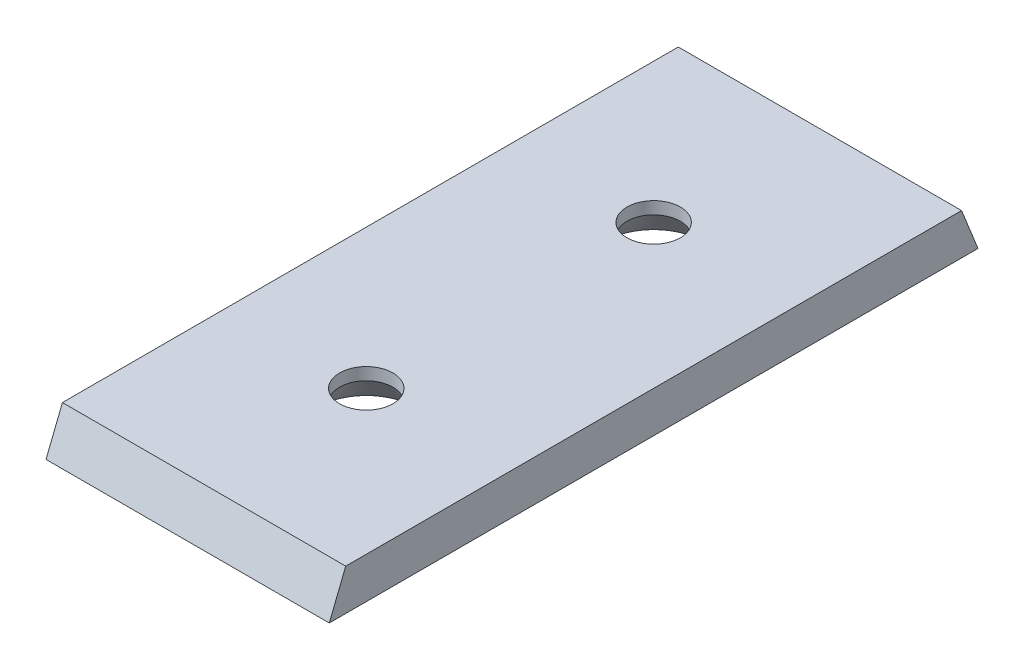
ISO-10303-21;
HEADER;
FILE_DESCRIPTION(('STEP AP214'),'2;1');
FILE_NAME('part.step','',(''),(''),'','','');
FILE_SCHEMA(('AUTOMOTIVE_DESIGN { 1 0 10303 214 1 1 1 1 }'));
ENDSEC;
DATA;
#1=APPLICATION_CONTEXT('core data for automotive mechanical design processes');
#2=APPLICATION_PROTOCOL_DEFINITION('international standard','automotive_design',2000,#1);
#3=PRODUCT_CONTEXT('',#1,'mechanical');
#4=PRODUCT('Part','Part','',(#3));
#5=PRODUCT_RELATED_PRODUCT_CATEGORY('part','',(#4));
#6=PRODUCT_DEFINITION_FORMATION('','',#4);
#7=PRODUCT_DEFINITION_CONTEXT('part definition',#1,'design');
#8=PRODUCT_DEFINITION('design','',#6,#7);
#9=PRODUCT_DEFINITION_SHAPE('','',#8);
#10=(LENGTH_UNIT() NAMED_UNIT(*) SI_UNIT(.MILLI.,.METRE.));
#11=(NAMED_UNIT(*) PLANE_ANGLE_UNIT() SI_UNIT($,.RADIAN.));
#12=(NAMED_UNIT(*) SI_UNIT($,.STERADIAN.) SOLID_ANGLE_UNIT());
#13=UNCERTAINTY_MEASURE_WITH_UNIT(LENGTH_MEASURE(1.E-05),#10,'distance_accuracy_value','');
#14=(GEOMETRIC_REPRESENTATION_CONTEXT(3) GLOBAL_UNCERTAINTY_ASSIGNED_CONTEXT((#13)) GLOBAL_UNIT_ASSIGNED_CONTEXT((#10,
#11,#12)) REPRESENTATION_CONTEXT('',''));
#15=CARTESIAN_POINT('',(0.,0.,0.));
#16=DIRECTION('',(0.,0.,1.));
#17=DIRECTION('',(1.,0.,0.));
#18=AXIS2_PLACEMENT_3D('',#15,#16,#17);
#19=CARTESIAN_POINT('',(-34.5,10.,-79.));
#20=DIRECTION('',(1.,0.,0.));
#21=DIRECTION('',(0.,0.,-1.));
#22=AXIS2_PLACEMENT_3D('',#19,#20,#21);
#23=PLANE('',#22);
#24=DIRECTION('',(0.,0.,1.));
#25=VECTOR('',#24,1.);
#26=CARTESIAN_POINT('',(-34.5,0.,-79.));
#27=LINE('',#26,#25);
#28=CARTESIAN_POINT('',(-34.5,0.,-79.));
#29=VERTEX_POINT('',#28);
#30=CARTESIAN_POINT('',(-34.5,0.,79.));
#31=VERTEX_POINT('',#30);
#32=EDGE_CURVE('E83',#29,#31,#27,.T.);
#33=ORIENTED_EDGE('',*,*,#32,.T.);
#34=DIRECTION('',(0.,-0.928485826880912,0.371367835550239));
#35=VECTOR('',#34,1.);
#36=CARTESIAN_POINT('',(-34.5,0.,79.));
#37=LINE('',#36,#35);
#38=CARTESIAN_POINT('',(-34.5,10.,75.0002853592523));
#39=VERTEX_POINT('',#38);
#40=EDGE_CURVE('E58',#39,#31,#37,.T.);
#41=ORIENTED_EDGE('',*,*,#40,.F.);
#42=DIRECTION('',(0.,0.,1.));
#43=VECTOR('',#42,1.);
#44=CARTESIAN_POINT('',(-34.5,10.,-79.));
#45=LINE('',#44,#43);
#46=CARTESIAN_POINT('',(-34.5,10.,-75.0002853592522));
#47=VERTEX_POINT('',#46);
#48=EDGE_CURVE('E97',#47,#39,#45,.T.);
#49=ORIENTED_EDGE('',*,*,#48,.F.);
#50=DIRECTION('',(0.,0.928485826880912,0.371367835550239));
#51=VECTOR('',#50,1.);
#52=CARTESIAN_POINT('',(-34.5,0.,-79.));
#53=LINE('',#52,#51);
#54=EDGE_CURVE('E92',#29,#47,#53,.T.);
#55=ORIENTED_EDGE('',*,*,#54,.F.);
#56=EDGE_LOOP('',(#33,#41,#49,#55));
#57=FACE_BOUND('',#56,.T.);
#58=ADVANCED_FACE('F35',(#57),#23,.F.);
#59=CARTESIAN_POINT('',(34.5,10.,-79.));
#60=DIRECTION('',(-1.,0.,0.));
#61=DIRECTION('',(0.,0.,1.));
#62=AXIS2_PLACEMENT_3D('',#59,#60,#61);
#63=PLANE('',#62);
#64=DIRECTION('',(0.,0.,-1.));
#65=VECTOR('',#64,1.);
#66=CARTESIAN_POINT('',(34.5,10.,-79.));
#67=LINE('',#66,#65);
#68=CARTESIAN_POINT('',(34.5,10.,75.0002853592522));
#69=VERTEX_POINT('',#68);
#70=CARTESIAN_POINT('',(34.5,10.,-75.0002853592522));
#71=VERTEX_POINT('',#70);
#72=EDGE_CURVE('E90',#69,#71,#67,.T.);
#73=ORIENTED_EDGE('',*,*,#72,.F.);
#74=DIRECTION('',(0.,0.928485826880912,-0.371367835550239));
#75=VECTOR('',#74,1.);
#76=CARTESIAN_POINT('',(34.5,0.,79.));
#77=LINE('',#76,#75);
#78=CARTESIAN_POINT('',(34.5,0.,79.));
#79=VERTEX_POINT('',#78);
#80=EDGE_CURVE('E76',#79,#69,#77,.T.);
#81=ORIENTED_EDGE('',*,*,#80,.F.);
#82=DIRECTION('',(0.,0.,-1.));
#83=VECTOR('',#82,1.);
#84=CARTESIAN_POINT('',(34.5,0.,-79.));
#85=LINE('',#84,#83);
#86=CARTESIAN_POINT('',(34.5,0.,-79.));
#87=VERTEX_POINT('',#86);
#88=EDGE_CURVE('E82',#79,#87,#85,.T.);
#89=ORIENTED_EDGE('',*,*,#88,.T.);
#90=DIRECTION('',(0.,-0.928485826880912,-0.371367835550239));
#91=VECTOR('',#90,1.);
#92=CARTESIAN_POINT('',(34.5,0.,-79.));
#93=LINE('',#92,#91);
#94=EDGE_CURVE('E50',#71,#87,#93,.T.);
#95=ORIENTED_EDGE('',*,*,#94,.F.);
#96=EDGE_LOOP('',(#73,#81,#89,#95));
#97=FACE_BOUND('',#96,.T.);
#98=ADVANCED_FACE('F87',(#97),#63,.F.);
#99=CARTESIAN_POINT('',(0.,10.,0.));
#100=DIRECTION('',(0.,1.,0.));
#101=DIRECTION('',(0.,0.,1.));
#102=AXIS2_PLACEMENT_3D('',#99,#100,#101);
#103=PLANE('',#102);
#104=DIRECTION('',(1.,0.,0.));
#105=VECTOR('',#104,1.);
#106=CARTESIAN_POINT('',(-34.501,10.,75.0002853592523));
#107=LINE('',#106,#105);
#108=EDGE_CURVE('E91',#39,#69,#107,.T.);
#109=ORIENTED_EDGE('',*,*,#108,.T.);
#110=ORIENTED_EDGE('',*,*,#72,.T.);
#111=DIRECTION('',(1.,0.,0.));
#112=VECTOR('',#111,1.);
#113=CARTESIAN_POINT('',(-34.5010000000001,10.,-75.0002853592522));
#114=LINE('',#113,#112);
#115=EDGE_CURVE('E159',#47,#71,#114,.T.);
#116=ORIENTED_EDGE('',*,*,#115,.F.);
#117=ORIENTED_EDGE('',*,*,#48,.T.);
#118=EDGE_LOOP('',(#109,#110,#116,#117));
#119=FACE_BOUND('',#118,.T.);
#120=CARTESIAN_POINT('',(-0.499999999999973,10.,-35.));
#121=DIRECTION('',(0.,1.,0.));
#122=DIRECTION('',(0.,0.,1.));
#123=AXIS2_PLACEMENT_3D('',#120,#121,#122);
#124=CIRCLE('',#123,6.5);
#125=CARTESIAN_POINT('',(-0.499999999999973,10.,-28.5));
#126=VERTEX_POINT('',#125);
#127=EDGE_CURVE('E148',#126,#126,#124,.F.);
#128=ORIENTED_EDGE('',*,*,#127,.T.);
#129=EDGE_LOOP('',(#128));
#130=FACE_BOUND('',#129,.T.);
#131=CARTESIAN_POINT('',(-0.49999999999998,10.,35.));
#132=DIRECTION('',(0.,1.,0.));
#133=DIRECTION('',(0.,0.,1.));
#134=AXIS2_PLACEMENT_3D('',#131,#132,#133);
#135=CIRCLE('',#134,6.5);
#136=CARTESIAN_POINT('',(-0.49999999999998,10.,41.5));
#137=VERTEX_POINT('',#136);
#138=EDGE_CURVE('E146',#137,#137,#135,.F.);
#139=ORIENTED_EDGE('',*,*,#138,.T.);
#140=EDGE_LOOP('',(#139));
#141=FACE_BOUND('',#140,.T.);
#142=ADVANCED_FACE('F129',(#119,#130,#141),#103,.T.);
#143=CARTESIAN_POINT('',(0.,0.,0.));
#144=DIRECTION('',(0.,1.,0.));
#145=DIRECTION('',(0.,0.,1.));
#146=AXIS2_PLACEMENT_3D('',#143,#144,#145);
#147=PLANE('',#146);
#148=CARTESIAN_POINT('',(-0.499999999999973,0.,-35.));
#149=DIRECTION('',(0.,1.,0.));
#150=DIRECTION('',(0.,0.,1.));
#151=AXIS2_PLACEMENT_3D('',#148,#149,#150);
#152=CIRCLE('',#151,12.);
#153=CARTESIAN_POINT('',(-0.499999999999973,0.,-23.));
#154=VERTEX_POINT('',#153);
#155=EDGE_CURVE('E11',#154,#154,#152,.T.);
#156=ORIENTED_EDGE('',*,*,#155,.T.);
#157=EDGE_LOOP('',(#156));
#158=FACE_BOUND('',#157,.T.);
#159=CARTESIAN_POINT('',(-0.49999999999998,0.,35.));
#160=DIRECTION('',(0.,1.,0.));
#161=DIRECTION('',(0.,0.,1.));
#162=AXIS2_PLACEMENT_3D('',#159,#160,#161);
#163=CIRCLE('',#162,12.);
#164=CARTESIAN_POINT('',(-0.49999999999998,0.,47.));
#165=VERTEX_POINT('',#164);
#166=EDGE_CURVE('E104',#165,#165,#163,.T.);
#167=ORIENTED_EDGE('',*,*,#166,.T.);
#168=EDGE_LOOP('',(#167));
#169=FACE_BOUND('',#168,.T.);
#170=ORIENTED_EDGE('',*,*,#32,.F.);
#171=DIRECTION('',(-1.,0.,0.));
#172=VECTOR('',#171,1.);
#173=CARTESIAN_POINT('',(-34.5,0.,-79.));
#174=LINE('',#173,#172);
#175=EDGE_CURVE('E95',#87,#29,#174,.T.);
#176=ORIENTED_EDGE('',*,*,#175,.F.);
#177=ORIENTED_EDGE('',*,*,#88,.F.);
#178=DIRECTION('',(1.,0.,0.));
#179=VECTOR('',#178,1.);
#180=CARTESIAN_POINT('',(-34.5,0.,79.));
#181=LINE('',#180,#179);
#182=EDGE_CURVE('E73',#31,#79,#181,.T.);
#183=ORIENTED_EDGE('',*,*,#182,.F.);
#184=EDGE_LOOP('',(#170,#176,#177,#183));
#185=FACE_BOUND('',#184,.T.);
#186=ADVANCED_FACE('F94',(#158,#169,#185),#147,.F.);
#187=CARTESIAN_POINT('',(-0.49999999999998,10.001,35.));
#188=DIRECTION('',(0.,-1.,0.));
#189=DIRECTION('',(0.,0.,-1.));
#190=AXIS2_PLACEMENT_3D('',#187,#188,#189);
#191=CYLINDRICAL_SURFACE('',#190,6.5);
#192=CARTESIAN_POINT('',(-0.49999999999998,6.99999999999997,35.));
#193=DIRECTION('',(0.,1.,0.));
#194=DIRECTION('',(0.,0.,1.));
#195=AXIS2_PLACEMENT_3D('',#192,#193,#194);
#196=CIRCLE('',#195,6.5);
#197=CARTESIAN_POINT('',(-0.49999999999998,6.99999999999997,41.5));
#198=VERTEX_POINT('',#197);
#199=EDGE_CURVE('E101',#198,#198,#196,.F.);
#200=ORIENTED_EDGE('',*,*,#199,.T.);
#201=EDGE_LOOP('',(#200));
#202=FACE_BOUND('',#201,.T.);
#203=ORIENTED_EDGE('',*,*,#138,.F.);
#204=EDGE_LOOP('',(#203));
#205=FACE_BOUND('',#204,.T.);
#206=ADVANCED_FACE('F133',(#202,#205),#191,.F.);
#207=CARTESIAN_POINT('',(-0.49999999999998,6.99999999999997,35.));
#208=DIRECTION('',(0.,-1.,0.));
#209=DIRECTION('',(0.,0.,-1.));
#210=AXIS2_PLACEMENT_3D('',#207,#208,#209);
#211=CONICAL_SURFACE('',#210,6.5,0.665969237379109);
#212=ORIENTED_EDGE('',*,*,#166,.F.);
#213=EDGE_LOOP('',(#212));
#214=FACE_BOUND('',#213,.T.);
#215=ORIENTED_EDGE('',*,*,#199,.F.);
#216=EDGE_LOOP('',(#215));
#217=FACE_BOUND('',#216,.T.);
#218=ADVANCED_FACE('F120',(#214,#217),#211,.F.);
#219=CARTESIAN_POINT('',(-0.499999999999973,10.001,-35.));
#220=DIRECTION('',(0.,-1.,0.));
#221=DIRECTION('',(0.,0.,-1.));
#222=AXIS2_PLACEMENT_3D('',#219,#220,#221);
#223=CYLINDRICAL_SURFACE('',#222,6.5);
#224=CARTESIAN_POINT('',(-0.499999999999973,7.00000000000004,-35.));
#225=DIRECTION('',(0.,1.,0.));
#226=DIRECTION('',(0.,0.,1.));
#227=AXIS2_PLACEMENT_3D('',#224,#225,#226);
#228=CIRCLE('',#227,6.5);
#229=CARTESIAN_POINT('',(-0.499999999999973,7.00000000000004,-28.5));
#230=VERTEX_POINT('',#229);
#231=EDGE_CURVE('E43',#230,#230,#228,.F.);
#232=ORIENTED_EDGE('',*,*,#231,.T.);
#233=EDGE_LOOP('',(#232));
#234=FACE_BOUND('',#233,.T.);
#235=ORIENTED_EDGE('',*,*,#127,.F.);
#236=EDGE_LOOP('',(#235));
#237=FACE_BOUND('',#236,.T.);
#238=ADVANCED_FACE('F109',(#234,#237),#223,.F.);
#239=CARTESIAN_POINT('',(-0.499999999999973,7.00000000000004,-35.));
#240=DIRECTION('',(0.,-1.,0.));
#241=DIRECTION('',(0.,0.,-1.));
#242=AXIS2_PLACEMENT_3D('',#239,#240,#241);
#243=CONICAL_SURFACE('',#242,6.5,0.665969237379108);
#244=ORIENTED_EDGE('',*,*,#155,.F.);
#245=EDGE_LOOP('',(#244));
#246=FACE_BOUND('',#245,.T.);
#247=ORIENTED_EDGE('',*,*,#231,.F.);
#248=EDGE_LOOP('',(#247));
#249=FACE_BOUND('',#248,.T.);
#250=ADVANCED_FACE('F37',(#246,#249),#243,.F.);
#251=CARTESIAN_POINT('',(-34.5010000000001,0.,-79.));
#252=DIRECTION('',(0.,-0.371367835550239,0.928485826880912));
#253=DIRECTION('',(0.,-0.928485826880912,-0.371367835550239));
#254=AXIS2_PLACEMENT_3D('',#251,#252,#253);
#255=PLANE('',#254);
#256=ORIENTED_EDGE('',*,*,#54,.T.);
#257=ORIENTED_EDGE('',*,*,#115,.T.);
#258=ORIENTED_EDGE('',*,*,#94,.T.);
#259=ORIENTED_EDGE('',*,*,#175,.T.);
#260=EDGE_LOOP('',(#256,#257,#258,#259));
#261=FACE_BOUND('',#260,.T.);
#262=ADVANCED_FACE('F113',(#261),#255,.F.);
#263=CARTESIAN_POINT('',(-34.501,0.,79.));
#264=DIRECTION('',(0.,-0.371367835550239,-0.928485826880912));
#265=DIRECTION('',(0.,0.928485826880912,-0.371367835550239));
#266=AXIS2_PLACEMENT_3D('',#263,#264,#265);
#267=PLANE('',#266);
#268=ORIENTED_EDGE('',*,*,#40,.T.);
#269=ORIENTED_EDGE('',*,*,#182,.T.);
#270=ORIENTED_EDGE('',*,*,#80,.T.);
#271=ORIENTED_EDGE('',*,*,#108,.F.);
#272=EDGE_LOOP('',(#268,#269,#270,#271));
#273=FACE_BOUND('',#272,.T.);
#274=ADVANCED_FACE('F75',(#273),#267,.F.);
#275=CLOSED_SHELL('',(#58,#98,#142,#186,#206,#218,#238,#250,#262,#274));
#276=MANIFOLD_SOLID_BREP('B2',#275);
#277=ADVANCED_BREP_SHAPE_REPRESENTATION('',(#18,#276),#14);
#278=SHAPE_DEFINITION_REPRESENTATION(#9,#277);
ENDSEC;
END-ISO-10303-21;
